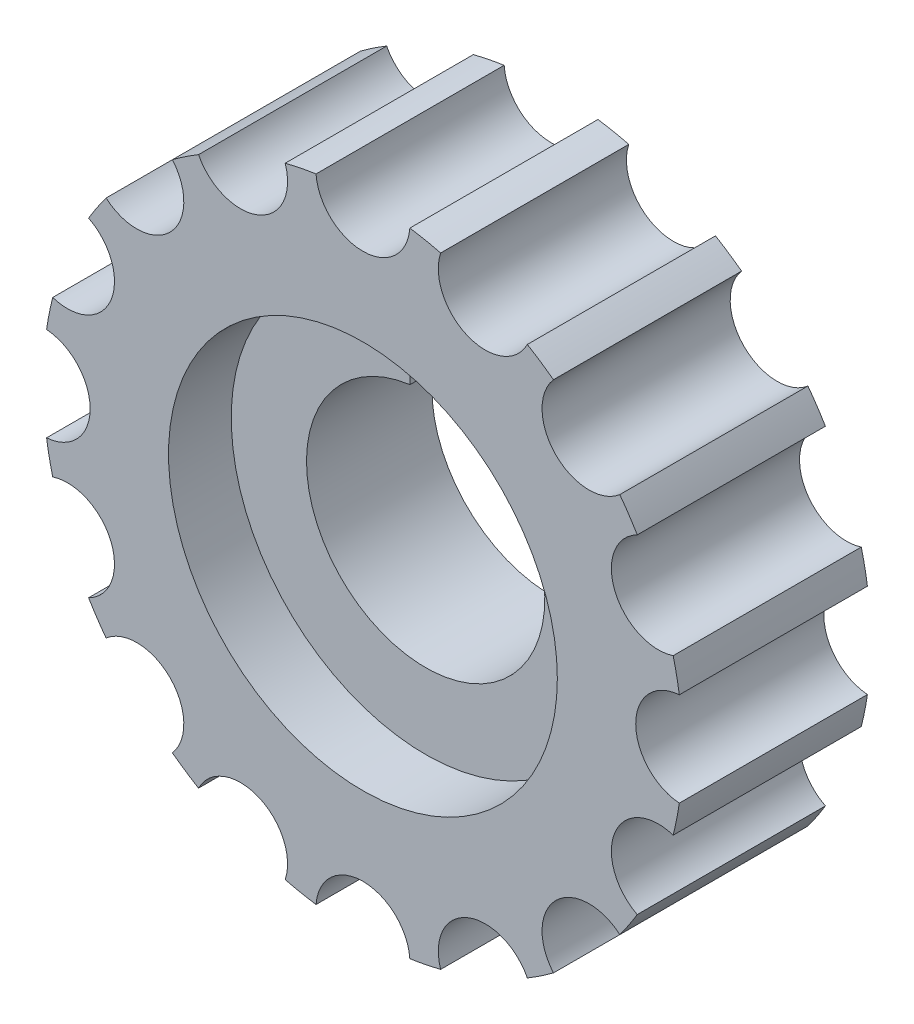
ISO-10303-21;
HEADER;
FILE_DESCRIPTION(('STEP AP214'),'2;1');
FILE_NAME('part.step','',(''),(''),'','','');
FILE_SCHEMA(('AUTOMOTIVE_DESIGN { 1 0 10303 214 1 1 1 1 }'));
ENDSEC;
DATA;
#1=APPLICATION_CONTEXT('core data for automotive mechanical design processes');
#2=APPLICATION_PROTOCOL_DEFINITION('international standard','automotive_design',2000,#1);
#3=PRODUCT_CONTEXT('',#1,'mechanical');
#4=PRODUCT('Part','Part','',(#3));
#5=PRODUCT_RELATED_PRODUCT_CATEGORY('part','',(#4));
#6=PRODUCT_DEFINITION_FORMATION('','',#4);
#7=PRODUCT_DEFINITION_CONTEXT('part definition',#1,'design');
#8=PRODUCT_DEFINITION('design','',#6,#7);
#9=PRODUCT_DEFINITION_SHAPE('','',#8);
#10=(LENGTH_UNIT() NAMED_UNIT(*) SI_UNIT(.MILLI.,.METRE.));
#11=(NAMED_UNIT(*) PLANE_ANGLE_UNIT() SI_UNIT($,.RADIAN.));
#12=(NAMED_UNIT(*) SI_UNIT($,.STERADIAN.) SOLID_ANGLE_UNIT());
#13=UNCERTAINTY_MEASURE_WITH_UNIT(LENGTH_MEASURE(1.E-05),#10,'distance_accuracy_value','');
#14=(GEOMETRIC_REPRESENTATION_CONTEXT(3) GLOBAL_UNCERTAINTY_ASSIGNED_CONTEXT((#13)) GLOBAL_UNIT_ASSIGNED_CONTEXT((#10,
#11,#12)) REPRESENTATION_CONTEXT('',''));
#15=CARTESIAN_POINT('',(0.,0.,0.));
#16=DIRECTION('',(0.,0.,1.));
#17=DIRECTION('',(1.,0.,0.));
#18=AXIS2_PLACEMENT_3D('',#15,#16,#17);
#19=CARTESIAN_POINT('',(0.,0.,0.));
#20=DIRECTION('',(0.,0.,1.));
#21=DIRECTION('',(1.,0.,0.));
#22=AXIS2_PLACEMENT_3D('',#19,#20,#21);
#23=PLANE('',#22);
#24=CARTESIAN_POINT('',(-19.5168550506189,47.1178561580759,0.));
#25=DIRECTION('',(0.,0.,1.));
#26=DIRECTION('',(1.,0.,0.));
#27=AXIS2_PLACEMENT_3D('',#24,#25,#26);
#28=CIRCLE('',#27,7.49999999999999);
#29=CARTESIAN_POINT('',(-26.2161561622921,43.7460073158033,0.));
#30=VERTEX_POINT('',#29);
#31=CARTESIAN_POINT('',(-12.3954766238373,49.4707202218434,0.));
#32=VERTEX_POINT('',#31);
#33=EDGE_CURVE('E307',#30,#32,#28,.T.);
#34=ORIENTED_EDGE('',*,*,#33,.T.);
#35=CARTESIAN_POINT('',(0.,0.,0.));
#36=DIRECTION('',(0.,0.,1.));
#37=DIRECTION('',(1.,0.,0.));
#38=AXIS2_PLACEMENT_3D('',#35,#36,#37);
#39=CIRCLE('',#38,51.);
#40=CARTESIAN_POINT('',(-7.47969786758203,50.4485294117647,0.));
#41=VERTEX_POINT('',#40);
#42=EDGE_CURVE('E317',#41,#32,#39,.T.);
#43=ORIENTED_EDGE('',*,*,#42,.F.);
#44=CARTESIAN_POINT('',(0.,51.,0.));
#45=DIRECTION('',(0.,0.,1.));
#46=DIRECTION('',(1.,0.,0.));
#47=AXIS2_PLACEMENT_3D('',#44,#45,#46);
#48=CIRCLE('',#47,7.49999999999999);
#49=CARTESIAN_POINT('',(7.47969786758203,50.4485294117647,0.));
#50=VERTEX_POINT('',#49);
#51=EDGE_CURVE('E386',#41,#50,#48,.T.);
#52=ORIENTED_EDGE('',*,*,#51,.T.);
#53=CARTESIAN_POINT('',(12.395476623838,49.4707202218432,0.));
#54=VERTEX_POINT('',#53);
#55=EDGE_CURVE('E287',#54,#50,#39,.T.);
#56=ORIENTED_EDGE('',*,*,#55,.F.);
#57=CARTESIAN_POINT('',(19.5168550506196,47.1178561580756,0.));
#58=DIRECTION('',(0.,0.,1.));
#59=DIRECTION('',(1.,0.,0.));
#60=AXIS2_PLACEMENT_3D('',#57,#58,#59);
#61=CIRCLE('',#60,7.49999999999999);
#62=CARTESIAN_POINT('',(26.2161561622927,43.7460073158029,0.));
#63=VERTEX_POINT('',#62);
#64=EDGE_CURVE('E382',#54,#63,#61,.T.);
#65=ORIENTED_EDGE('',*,*,#64,.T.);
#66=CARTESIAN_POINT('',(30.3835521645541,40.9614423313416,0.));
#67=VERTEX_POINT('',#66);
#68=EDGE_CURVE('E381',#67,#63,#39,.T.);
#69=ORIENTED_EDGE('',*,*,#68,.F.);
#70=CARTESIAN_POINT('',(36.062445840514,36.0624458405139,0.));
#71=DIRECTION('',(0.,0.,1.));
#72=DIRECTION('',(1.,0.,0.));
#73=AXIS2_PLACEMENT_3D('',#70,#71,#72);
#74=CIRCLE('',#73,7.49999999999999);
#75=CARTESIAN_POINT('',(40.9614423313417,30.3835521645539,0.));
#76=VERTEX_POINT('',#75);
#77=EDGE_CURVE('E377',#67,#76,#74,.T.);
#78=ORIENTED_EDGE('',*,*,#77,.T.);
#79=CARTESIAN_POINT('',(43.746007315803,26.2161561622925,0.));
#80=VERTEX_POINT('',#79);
#81=EDGE_CURVE('E376',#80,#76,#39,.T.);
#82=ORIENTED_EDGE('',*,*,#81,.F.);
#83=CARTESIAN_POINT('',(47.1178561580757,19.5168550506195,0.));
#84=DIRECTION('',(0.,0.,1.));
#85=DIRECTION('',(1.,0.,0.));
#86=AXIS2_PLACEMENT_3D('',#83,#84,#85);
#87=CIRCLE('',#86,7.49999999999999);
#88=CARTESIAN_POINT('',(49.4707202218433,12.3954766238378,0.));
#89=VERTEX_POINT('',#88);
#90=EDGE_CURVE('E372',#80,#89,#87,.T.);
#91=ORIENTED_EDGE('',*,*,#90,.T.);
#92=CARTESIAN_POINT('',(50.4485294117647,7.47969786758186,0.));
#93=VERTEX_POINT('',#92);
#94=EDGE_CURVE('E371',#93,#89,#39,.T.);
#95=ORIENTED_EDGE('',*,*,#94,.F.);
#96=CARTESIAN_POINT('',(51.,-1.78065548281E-13,0.));
#97=DIRECTION('',(0.,0.,1.));
#98=DIRECTION('',(1.,0.,0.));
#99=AXIS2_PLACEMENT_3D('',#96,#97,#98);
#100=CIRCLE('',#99,7.49999999999999);
#101=CARTESIAN_POINT('',(50.4485294117647,-7.47969786758221,0.));
#102=VERTEX_POINT('',#101);
#103=EDGE_CURVE('E367',#93,#102,#100,.T.);
#104=ORIENTED_EDGE('',*,*,#103,.T.);
#105=CARTESIAN_POINT('',(49.4707202218432,-12.3954766238382,0.));
#106=VERTEX_POINT('',#105);
#107=EDGE_CURVE('E366',#106,#102,#39,.T.);
#108=ORIENTED_EDGE('',*,*,#107,.F.);
#109=CARTESIAN_POINT('',(47.1178561580755,-19.5168550506198,0.));
#110=DIRECTION('',(0.,0.,1.));
#111=DIRECTION('',(1.,0.,0.));
#112=AXIS2_PLACEMENT_3D('',#109,#110,#111);
#113=CIRCLE('',#112,7.49999999999999);
#114=CARTESIAN_POINT('',(43.7460073158028,-26.2161561622929,0.));
#115=VERTEX_POINT('',#114);
#116=EDGE_CURVE('E362',#106,#115,#113,.T.);
#117=ORIENTED_EDGE('',*,*,#116,.T.);
#118=CARTESIAN_POINT('',(40.9614423313415,-30.3835521645542,0.));
#119=VERTEX_POINT('',#118);
#120=EDGE_CURVE('E361',#119,#115,#39,.T.);
#121=ORIENTED_EDGE('',*,*,#120,.F.);
#122=CARTESIAN_POINT('',(36.0624458405137,-36.0624458405141,0.));
#123=DIRECTION('',(0.,0.,1.));
#124=DIRECTION('',(1.,0.,0.));
#125=AXIS2_PLACEMENT_3D('',#122,#123,#124);
#126=CIRCLE('',#125,7.49999999999999);
#127=CARTESIAN_POINT('',(30.3835521645538,-40.9614423313418,0.));
#128=VERTEX_POINT('',#127);
#129=EDGE_CURVE('E357',#119,#128,#126,.T.);
#130=ORIENTED_EDGE('',*,*,#129,.T.);
#131=CARTESIAN_POINT('',(26.2161561622924,-43.7460073158031,0.));
#132=VERTEX_POINT('',#131);
#133=EDGE_CURVE('E356',#132,#128,#39,.T.);
#134=ORIENTED_EDGE('',*,*,#133,.F.);
#135=CARTESIAN_POINT('',(19.5168550506193,-47.1178561580757,0.));
#136=DIRECTION('',(0.,0.,1.));
#137=DIRECTION('',(1.,0.,0.));
#138=AXIS2_PLACEMENT_3D('',#135,#136,#137);
#139=CIRCLE('',#138,7.49999999999998);
#140=CARTESIAN_POINT('',(12.3954766238376,-49.4707202218433,0.));
#141=VERTEX_POINT('',#140);
#142=EDGE_CURVE('E352',#132,#141,#139,.T.);
#143=ORIENTED_EDGE('',*,*,#142,.T.);
#144=CARTESIAN_POINT('',(7.47969786758168,-50.4485294117648,0.));
#145=VERTEX_POINT('',#144);
#146=EDGE_CURVE('E351',#145,#141,#39,.T.);
#147=ORIENTED_EDGE('',*,*,#146,.F.);
#148=CARTESIAN_POINT('',(-3.56131096562E-13,-51.,0.));
#149=DIRECTION('',(0.,0.,1.));
#150=DIRECTION('',(1.,0.,0.));
#151=AXIS2_PLACEMENT_3D('',#148,#149,#150);
#152=CIRCLE('',#151,7.49999999999999);
#153=CARTESIAN_POINT('',(-7.47969786758239,-50.4485294117647,0.));
#154=VERTEX_POINT('',#153);
#155=EDGE_CURVE('E347',#145,#154,#152,.T.);
#156=ORIENTED_EDGE('',*,*,#155,.T.);
#157=CARTESIAN_POINT('',(-12.3954766238383,-49.4707202218431,0.));
#158=VERTEX_POINT('',#157);
#159=EDGE_CURVE('E346',#158,#154,#39,.T.);
#160=ORIENTED_EDGE('',*,*,#159,.F.);
#161=CARTESIAN_POINT('',(-19.5168550506199,-47.1178561580755,0.));
#162=DIRECTION('',(0.,0.,1.));
#163=DIRECTION('',(1.,0.,0.));
#164=AXIS2_PLACEMENT_3D('',#161,#162,#163);
#165=CIRCLE('',#164,7.49999999999999);
#166=CARTESIAN_POINT('',(-26.216156162293,-43.7460073158027,0.));
#167=VERTEX_POINT('',#166);
#168=EDGE_CURVE('E342',#158,#167,#165,.T.);
#169=ORIENTED_EDGE('',*,*,#168,.T.);
#170=CARTESIAN_POINT('',(-30.3835521645544,-40.9614423313414,0.));
#171=VERTEX_POINT('',#170);
#172=EDGE_CURVE('E341',#171,#167,#39,.T.);
#173=ORIENTED_EDGE('',*,*,#172,.F.);
#174=CARTESIAN_POINT('',(-36.0624458405142,-36.0624458405136,0.));
#175=DIRECTION('',(0.,0.,1.));
#176=DIRECTION('',(1.,0.,0.));
#177=AXIS2_PLACEMENT_3D('',#174,#175,#176);
#178=CIRCLE('',#177,7.49999999999998);
#179=CARTESIAN_POINT('',(-40.9614423313419,-30.3835521645536,0.));
#180=VERTEX_POINT('',#179);
#181=EDGE_CURVE('E337',#171,#180,#178,.T.);
#182=ORIENTED_EDGE('',*,*,#181,.T.);
#183=CARTESIAN_POINT('',(-43.7460073158032,-26.2161561622922,0.));
#184=VERTEX_POINT('',#183);
#185=EDGE_CURVE('E336',#184,#180,#39,.T.);
#186=ORIENTED_EDGE('',*,*,#185,.F.);
#187=CARTESIAN_POINT('',(-47.1178561580758,-19.5168550506191,0.));
#188=DIRECTION('',(0.,0.,1.));
#189=DIRECTION('',(1.,0.,0.));
#190=AXIS2_PLACEMENT_3D('',#187,#188,#189);
#191=CIRCLE('',#190,7.49999999999999);
#192=CARTESIAN_POINT('',(-49.4707202218433,-12.3954766238374,0.));
#193=VERTEX_POINT('',#192);
#194=EDGE_CURVE('E332',#184,#193,#191,.T.);
#195=ORIENTED_EDGE('',*,*,#194,.T.);
#196=CARTESIAN_POINT('',(-50.4485294117648,-7.47969786758151,0.));
#197=VERTEX_POINT('',#196);
#198=EDGE_CURVE('E331',#197,#193,#39,.T.);
#199=ORIENTED_EDGE('',*,*,#198,.F.);
#200=CARTESIAN_POINT('',(-51.,5.34196644842999E-13,0.));
#201=DIRECTION('',(0.,0.,1.));
#202=DIRECTION('',(1.,0.,0.));
#203=AXIS2_PLACEMENT_3D('',#200,#201,#202);
#204=CIRCLE('',#203,7.49999999999999);
#205=CARTESIAN_POINT('',(-50.4485294117646,7.47969786758256,0.));
#206=VERTEX_POINT('',#205);
#207=EDGE_CURVE('E327',#197,#206,#204,.T.);
#208=ORIENTED_EDGE('',*,*,#207,.T.);
#209=CARTESIAN_POINT('',(-49.4707202218431,12.3954766238385,0.));
#210=VERTEX_POINT('',#209);
#211=EDGE_CURVE('E326',#210,#206,#39,.T.);
#212=ORIENTED_EDGE('',*,*,#211,.F.);
#213=CARTESIAN_POINT('',(-47.1178561580754,19.5168550506201,0.));
#214=DIRECTION('',(0.,0.,1.));
#215=DIRECTION('',(1.,0.,0.));
#216=AXIS2_PLACEMENT_3D('',#213,#214,#215);
#217=CIRCLE('',#216,7.49999999999999);
#218=CARTESIAN_POINT('',(-43.7460073158027,26.2161561622931,0.));
#219=VERTEX_POINT('',#218);
#220=EDGE_CURVE('E322',#210,#219,#217,.T.);
#221=ORIENTED_EDGE('',*,*,#220,.T.);
#222=CARTESIAN_POINT('',(-40.9614423313413,30.3835521645545,0.));
#223=VERTEX_POINT('',#222);
#224=EDGE_CURVE('E318',#223,#219,#39,.T.);
#225=ORIENTED_EDGE('',*,*,#224,.F.);
#226=CARTESIAN_POINT('',(-36.0624458405135,36.0624458405144,0.));
#227=DIRECTION('',(0.,0.,1.));
#228=DIRECTION('',(1.,0.,0.));
#229=AXIS2_PLACEMENT_3D('',#226,#227,#228);
#230=CIRCLE('',#229,7.49999999999999);
#231=CARTESIAN_POINT('',(-30.3835521645535,40.961442331342,0.));
#232=VERTEX_POINT('',#231);
#233=EDGE_CURVE('E316',#223,#232,#230,.T.);
#234=ORIENTED_EDGE('',*,*,#233,.T.);
#235=EDGE_CURVE('E311',#30,#232,#39,.T.);
#236=ORIENTED_EDGE('',*,*,#235,.F.);
#237=EDGE_LOOP('',(#34,#43,#52,#56,#65,#69,#78,#82,#91,#95,#104,#108,#117,#121,#130,#134,#143,
#147,#156,#160,#169,#173,#182,#186,#195,#199,#208,#212,#221,#225,#234,#236));
#238=FACE_BOUND('',#237,.T.);
#239=DIRECTION('',(0.,1.,0.));
#240=VECTOR('',#239,1.);
#241=CARTESIAN_POINT('',(2.5,24.7671208505366,0.));
#242=LINE('',#241,#240);
#243=CARTESIAN_POINT('',(2.5,18.8348082018374,0.));
#244=VERTEX_POINT('',#243);
#245=CARTESIAN_POINT('',(2.5,24.7671208505366,0.));
#246=VERTEX_POINT('',#245);
#247=EDGE_CURVE('E1071',#244,#246,#242,.T.);
#248=ORIENTED_EDGE('',*,*,#247,.T.);
#249=DIRECTION('',(-1.,0.,0.));
#250=VECTOR('',#249,1.);
#251=CARTESIAN_POINT('',(-2.5,24.7671208505366,0.));
#252=LINE('',#251,#250);
#253=CARTESIAN_POINT('',(-2.5,24.7671208505366,0.));
#254=VERTEX_POINT('',#253);
#255=EDGE_CURVE('E1066',#246,#254,#252,.T.);
#256=ORIENTED_EDGE('',*,*,#255,.T.);
#257=DIRECTION('',(0.,-1.,0.));
#258=VECTOR('',#257,1.);
#259=CARTESIAN_POINT('',(-2.5,24.7671208505366,0.));
#260=LINE('',#259,#258);
#261=CARTESIAN_POINT('',(-2.5,18.8348082018374,0.));
#262=VERTEX_POINT('',#261);
#263=EDGE_CURVE('E1054',#254,#262,#260,.T.);
#264=ORIENTED_EDGE('',*,*,#263,.T.);
#265=CARTESIAN_POINT('',(0.,0.,0.));
#266=DIRECTION('',(0.,0.,1.));
#267=DIRECTION('',(1.,0.,0.));
#268=AXIS2_PLACEMENT_3D('',#265,#266,#267);
#269=CIRCLE('',#268,19.);
#270=EDGE_CURVE('E669',#262,#244,#269,.T.);
#271=ORIENTED_EDGE('',*,*,#270,.T.);
#272=EDGE_LOOP('',(#248,#256,#264,#271));
#273=FACE_BOUND('',#272,.T.);
#274=ADVANCED_FACE('F45',(#238,#273),#23,.F.);
#275=CARTESIAN_POINT('',(0.,0.,20.));
#276=DIRECTION('',(0.,0.,-1.));
#277=DIRECTION('',(-1.,0.,0.));
#278=AXIS2_PLACEMENT_3D('',#275,#276,#277);
#279=CYLINDRICAL_SURFACE('',#278,19.);
#280=CARTESIAN_POINT('',(0.,0.,20.));
#281=DIRECTION('',(0.,0.,1.));
#282=DIRECTION('',(1.,0.,0.));
#283=AXIS2_PLACEMENT_3D('',#280,#281,#282);
#284=CIRCLE('',#283,19.);
#285=CARTESIAN_POINT('',(-2.5,18.8348082018374,20.));
#286=VERTEX_POINT('',#285);
#287=CARTESIAN_POINT('',(2.5,18.8348082018374,20.));
#288=VERTEX_POINT('',#287);
#289=EDGE_CURVE('E312',#286,#288,#284,.T.);
#290=ORIENTED_EDGE('',*,*,#289,.T.);
#291=DIRECTION('',(0.,0.,-1.));
#292=VECTOR('',#291,1.);
#293=CARTESIAN_POINT('',(2.5,18.8348082018374,20.));
#294=LINE('',#293,#292);
#295=EDGE_CURVE('E1088',#288,#244,#294,.T.);
#296=ORIENTED_EDGE('',*,*,#295,.T.);
#297=ORIENTED_EDGE('',*,*,#270,.F.);
#298=DIRECTION('',(0.,0.,-1.));
#299=VECTOR('',#298,1.);
#300=CARTESIAN_POINT('',(-2.5,18.8348082018374,20.));
#301=LINE('',#300,#299);
#302=EDGE_CURVE('E1058',#262,#286,#301,.F.);
#303=ORIENTED_EDGE('',*,*,#302,.T.);
#304=EDGE_LOOP('',(#290,#296,#297,#303));
#305=FACE_BOUND('',#304,.T.);
#306=ADVANCED_FACE('F502',(#305),#279,.F.);
#307=CARTESIAN_POINT('',(0.,0.,20.));
#308=DIRECTION('',(0.,0.,1.));
#309=DIRECTION('',(1.,0.,0.));
#310=AXIS2_PLACEMENT_3D('',#307,#308,#309);
#311=PLANE('',#310);
#312=CARTESIAN_POINT('',(0.,0.,20.));
#313=DIRECTION('',(0.,0.,1.));
#314=DIRECTION('',(1.,0.,0.));
#315=AXIS2_PLACEMENT_3D('',#312,#313,#314);
#316=CIRCLE('',#315,31.);
#317=CARTESIAN_POINT('',(31.,0.,20.));
#318=VERTEX_POINT('',#317);
#319=EDGE_CURVE('E54',#318,#318,#316,.T.);
#320=ORIENTED_EDGE('',*,*,#319,.T.);
#321=EDGE_LOOP('',(#320));
#322=FACE_BOUND('',#321,.T.);
#323=DIRECTION('',(-1.,0.,0.));
#324=VECTOR('',#323,1.);
#325=CARTESIAN_POINT('',(-2.5,24.7671208505366,20.));
#326=LINE('',#325,#324);
#327=CARTESIAN_POINT('',(2.5,24.7671208505366,20.));
#328=VERTEX_POINT('',#327);
#329=CARTESIAN_POINT('',(-2.5,24.7671208505366,20.));
#330=VERTEX_POINT('',#329);
#331=EDGE_CURVE('E1065',#328,#330,#326,.T.);
#332=ORIENTED_EDGE('',*,*,#331,.F.);
#333=DIRECTION('',(0.,-1.,0.));
#334=VECTOR('',#333,1.);
#335=CARTESIAN_POINT('',(2.5,0.,20.));
#336=LINE('',#335,#334);
#337=EDGE_CURVE('E11',#328,#288,#336,.T.);
#338=ORIENTED_EDGE('',*,*,#337,.T.);
#339=ORIENTED_EDGE('',*,*,#289,.F.);
#340=DIRECTION('',(0.,-1.,0.));
#341=VECTOR('',#340,1.);
#342=CARTESIAN_POINT('',(-2.5,24.7671208505366,20.));
#343=LINE('',#342,#341);
#344=EDGE_CURVE('E1083',#330,#286,#343,.T.);
#345=ORIENTED_EDGE('',*,*,#344,.F.);
#346=EDGE_LOOP('',(#332,#338,#339,#345));
#347=FACE_BOUND('',#346,.T.);
#348=ADVANCED_FACE('F481',(#322,#347),#311,.T.);
#349=CARTESIAN_POINT('',(-19.5168550506189,47.1178561580759,30.));
#350=DIRECTION('',(0.,0.,-1.));
#351=DIRECTION('',(-1.,0.,0.));
#352=AXIS2_PLACEMENT_3D('',#349,#350,#351);
#353=CYLINDRICAL_SURFACE('',#352,7.49999999999999);
#354=ORIENTED_EDGE('',*,*,#33,.F.);
#355=DIRECTION('',(0.,0.,-1.));
#356=VECTOR('',#355,1.);
#357=CARTESIAN_POINT('',(-26.2161561622921,43.7460073158033,30.));
#358=LINE('',#357,#356);
#359=CARTESIAN_POINT('',(-26.2161561622921,43.7460073158033,30.));
#360=VERTEX_POINT('',#359);
#361=EDGE_CURVE('E181',#360,#30,#358,.T.);
#362=ORIENTED_EDGE('',*,*,#361,.F.);
#363=CARTESIAN_POINT('',(-19.5168550506189,47.1178561580759,30.));
#364=DIRECTION('',(0.,0.,1.));
#365=DIRECTION('',(1.,0.,0.));
#366=AXIS2_PLACEMENT_3D('',#363,#364,#365);
#367=CIRCLE('',#366,7.49999999999999);
#368=CARTESIAN_POINT('',(-12.3954766238373,49.4707202218434,30.));
#369=VERTEX_POINT('',#368);
#370=EDGE_CURVE('E661',#360,#369,#367,.T.);
#371=ORIENTED_EDGE('',*,*,#370,.T.);
#372=DIRECTION('',(0.,0.,-1.));
#373=VECTOR('',#372,1.);
#374=CARTESIAN_POINT('',(-12.3954766238373,49.4707202218434,30.));
#375=LINE('',#374,#373);
#376=EDGE_CURVE('E176',#369,#32,#375,.T.);
#377=ORIENTED_EDGE('',*,*,#376,.T.);
#378=EDGE_LOOP('',(#354,#362,#371,#377));
#379=FACE_BOUND('',#378,.T.);
#380=ADVANCED_FACE('F47',(#379),#353,.F.);
#381=CARTESIAN_POINT('',(0.,0.,30.));
#382=DIRECTION('',(0.,0.,-1.));
#383=DIRECTION('',(-1.,0.,0.));
#384=AXIS2_PLACEMENT_3D('',#381,#382,#383);
#385=CYLINDRICAL_SURFACE('',#384,51.);
#386=ORIENTED_EDGE('',*,*,#235,.T.);
#387=DIRECTION('',(0.,0.,-1.));
#388=VECTOR('',#387,1.);
#389=CARTESIAN_POINT('',(-30.3835521645535,40.961442331342,30.));
#390=LINE('',#389,#388);
#391=CARTESIAN_POINT('',(-30.3835521645535,40.961442331342,30.));
#392=VERTEX_POINT('',#391);
#393=EDGE_CURVE('E473',#392,#232,#390,.T.);
#394=ORIENTED_EDGE('',*,*,#393,.F.);
#395=CARTESIAN_POINT('',(0.,0.,30.));
#396=DIRECTION('',(0.,0.,1.));
#397=DIRECTION('',(1.,0.,0.));
#398=AXIS2_PLACEMENT_3D('',#395,#396,#397);
#399=CIRCLE('',#398,51.);
#400=EDGE_CURVE('E300',#360,#392,#399,.T.);
#401=ORIENTED_EDGE('',*,*,#400,.F.);
#402=ORIENTED_EDGE('',*,*,#361,.T.);
#403=EDGE_LOOP('',(#386,#394,#401,#402));
#404=FACE_BOUND('',#403,.T.);
#405=ADVANCED_FACE('F513',(#404),#385,.T.);
#406=CARTESIAN_POINT('',(-36.0624458405135,36.0624458405144,30.));
#407=DIRECTION('',(0.,0.,-1.));
#408=DIRECTION('',(-1.,0.,0.));
#409=AXIS2_PLACEMENT_3D('',#406,#407,#408);
#410=CYLINDRICAL_SURFACE('',#409,7.49999999999999);
#411=ORIENTED_EDGE('',*,*,#233,.F.);
#412=DIRECTION('',(0.,0.,-1.));
#413=VECTOR('',#412,1.);
#414=CARTESIAN_POINT('',(-40.9614423313413,30.3835521645545,30.));
#415=LINE('',#414,#413);
#416=CARTESIAN_POINT('',(-40.9614423313413,30.3835521645545,30.));
#417=VERTEX_POINT('',#416);
#418=EDGE_CURVE('E470',#417,#223,#415,.T.);
#419=ORIENTED_EDGE('',*,*,#418,.F.);
#420=CARTESIAN_POINT('',(-36.0624458405135,36.0624458405144,30.));
#421=DIRECTION('',(0.,0.,1.));
#422=DIRECTION('',(1.,0.,0.));
#423=AXIS2_PLACEMENT_3D('',#420,#421,#422);
#424=CIRCLE('',#423,7.49999999999999);
#425=EDGE_CURVE('E666',#417,#392,#424,.T.);
#426=ORIENTED_EDGE('',*,*,#425,.T.);
#427=ORIENTED_EDGE('',*,*,#393,.T.);
#428=EDGE_LOOP('',(#411,#419,#426,#427));
#429=FACE_BOUND('',#428,.T.);
#430=ADVANCED_FACE('F580',(#429),#410,.F.);
#431=ORIENTED_EDGE('',*,*,#224,.T.);
#432=DIRECTION('',(0.,0.,-1.));
#433=VECTOR('',#432,1.);
#434=CARTESIAN_POINT('',(-43.7460073158027,26.2161561622931,30.));
#435=LINE('',#434,#433);
#436=CARTESIAN_POINT('',(-43.7460073158027,26.2161561622931,30.));
#437=VERTEX_POINT('',#436);
#438=EDGE_CURVE('E467',#437,#219,#435,.T.);
#439=ORIENTED_EDGE('',*,*,#438,.F.);
#440=EDGE_CURVE('E667',#417,#437,#399,.T.);
#441=ORIENTED_EDGE('',*,*,#440,.F.);
#442=ORIENTED_EDGE('',*,*,#418,.T.);
#443=EDGE_LOOP('',(#431,#439,#441,#442));
#444=FACE_BOUND('',#443,.T.);
#445=ADVANCED_FACE('F578',(#444),#385,.T.);
#446=CARTESIAN_POINT('',(-47.1178561580754,19.5168550506201,30.));
#447=DIRECTION('',(0.,0.,-1.));
#448=DIRECTION('',(-1.,0.,0.));
#449=AXIS2_PLACEMENT_3D('',#446,#447,#448);
#450=CYLINDRICAL_SURFACE('',#449,7.49999999999999);
#451=ORIENTED_EDGE('',*,*,#220,.F.);
#452=DIRECTION('',(0.,0.,-1.));
#453=VECTOR('',#452,1.);
#454=CARTESIAN_POINT('',(-49.4707202218431,12.3954766238385,30.));
#455=LINE('',#454,#453);
#456=CARTESIAN_POINT('',(-49.4707202218431,12.3954766238385,30.));
#457=VERTEX_POINT('',#456);
#458=EDGE_CURVE('E464',#457,#210,#455,.T.);
#459=ORIENTED_EDGE('',*,*,#458,.F.);
#460=CARTESIAN_POINT('',(-47.1178561580754,19.5168550506201,30.));
#461=DIRECTION('',(0.,0.,1.));
#462=DIRECTION('',(1.,0.,0.));
#463=AXIS2_PLACEMENT_3D('',#460,#461,#462);
#464=CIRCLE('',#463,7.49999999999999);
#465=EDGE_CURVE('E674',#457,#437,#464,.T.);
#466=ORIENTED_EDGE('',*,*,#465,.T.);
#467=ORIENTED_EDGE('',*,*,#438,.T.);
#468=EDGE_LOOP('',(#451,#459,#466,#467));
#469=FACE_BOUND('',#468,.T.);
#470=ADVANCED_FACE('F576',(#469),#450,.F.);
#471=ORIENTED_EDGE('',*,*,#211,.T.);
#472=DIRECTION('',(0.,0.,-1.));
#473=VECTOR('',#472,1.);
#474=CARTESIAN_POINT('',(-50.4485294117646,7.47969786758256,30.));
#475=LINE('',#474,#473);
#476=CARTESIAN_POINT('',(-50.4485294117646,7.47969786758256,30.));
#477=VERTEX_POINT('',#476);
#478=EDGE_CURVE('E461',#477,#206,#475,.T.);
#479=ORIENTED_EDGE('',*,*,#478,.F.);
#480=EDGE_CURVE('E678',#457,#477,#399,.T.);
#481=ORIENTED_EDGE('',*,*,#480,.F.);
#482=ORIENTED_EDGE('',*,*,#458,.T.);
#483=EDGE_LOOP('',(#471,#479,#481,#482));
#484=FACE_BOUND('',#483,.T.);
#485=ADVANCED_FACE('F574',(#484),#385,.T.);
#486=CARTESIAN_POINT('',(-51.,5.34196644842999E-13,30.));
#487=DIRECTION('',(0.,0.,-1.));
#488=DIRECTION('',(-1.,0.,0.));
#489=AXIS2_PLACEMENT_3D('',#486,#487,#488);
#490=CYLINDRICAL_SURFACE('',#489,7.49999999999999);
#491=ORIENTED_EDGE('',*,*,#207,.F.);
#492=DIRECTION('',(0.,0.,-1.));
#493=VECTOR('',#492,1.);
#494=CARTESIAN_POINT('',(-50.4485294117648,-7.47969786758151,30.));
#495=LINE('',#494,#493);
#496=CARTESIAN_POINT('',(-50.4485294117648,-7.47969786758151,30.));
#497=VERTEX_POINT('',#496);
#498=EDGE_CURVE('E458',#497,#197,#495,.T.);
#499=ORIENTED_EDGE('',*,*,#498,.F.);
#500=CARTESIAN_POINT('',(-51.,5.34196644842999E-13,30.));
#501=DIRECTION('',(0.,0.,1.));
#502=DIRECTION('',(1.,0.,0.));
#503=AXIS2_PLACEMENT_3D('',#500,#501,#502);
#504=CIRCLE('',#503,7.49999999999999);
#505=EDGE_CURVE('E679',#497,#477,#504,.T.);
#506=ORIENTED_EDGE('',*,*,#505,.T.);
#507=ORIENTED_EDGE('',*,*,#478,.T.);
#508=EDGE_LOOP('',(#491,#499,#506,#507));
#509=FACE_BOUND('',#508,.T.);
#510=ADVANCED_FACE('F571',(#509),#490,.F.);
#511=ORIENTED_EDGE('',*,*,#198,.T.);
#512=DIRECTION('',(0.,0.,-1.));
#513=VECTOR('',#512,1.);
#514=CARTESIAN_POINT('',(-49.4707202218433,-12.3954766238374,30.));
#515=LINE('',#514,#513);
#516=CARTESIAN_POINT('',(-49.4707202218433,-12.3954766238374,30.));
#517=VERTEX_POINT('',#516);
#518=EDGE_CURVE('E455',#517,#193,#515,.T.);
#519=ORIENTED_EDGE('',*,*,#518,.F.);
#520=EDGE_CURVE('E683',#497,#517,#399,.T.);
#521=ORIENTED_EDGE('',*,*,#520,.F.);
#522=ORIENTED_EDGE('',*,*,#498,.T.);
#523=EDGE_LOOP('',(#511,#519,#521,#522));
#524=FACE_BOUND('',#523,.T.);
#525=ADVANCED_FACE('F569',(#524),#385,.T.);
#526=CARTESIAN_POINT('',(-47.1178561580758,-19.5168550506191,30.));
#527=DIRECTION('',(0.,0.,-1.));
#528=DIRECTION('',(-1.,0.,0.));
#529=AXIS2_PLACEMENT_3D('',#526,#527,#528);
#530=CYLINDRICAL_SURFACE('',#529,7.49999999999999);
#531=ORIENTED_EDGE('',*,*,#194,.F.);
#532=DIRECTION('',(0.,0.,-1.));
#533=VECTOR('',#532,1.);
#534=CARTESIAN_POINT('',(-43.7460073158032,-26.2161561622922,30.));
#535=LINE('',#534,#533);
#536=CARTESIAN_POINT('',(-43.7460073158032,-26.2161561622922,30.));
#537=VERTEX_POINT('',#536);
#538=EDGE_CURVE('E452',#537,#184,#535,.T.);
#539=ORIENTED_EDGE('',*,*,#538,.F.);
#540=CARTESIAN_POINT('',(-47.1178561580758,-19.5168550506191,30.));
#541=DIRECTION('',(0.,0.,1.));
#542=DIRECTION('',(1.,0.,0.));
#543=AXIS2_PLACEMENT_3D('',#540,#541,#542);
#544=CIRCLE('',#543,7.49999999999999);
#545=EDGE_CURVE('E684',#537,#517,#544,.T.);
#546=ORIENTED_EDGE('',*,*,#545,.T.);
#547=ORIENTED_EDGE('',*,*,#518,.T.);
#548=EDGE_LOOP('',(#531,#539,#546,#547));
#549=FACE_BOUND('',#548,.T.);
#550=ADVANCED_FACE('F566',(#549),#530,.F.);
#551=ORIENTED_EDGE('',*,*,#185,.T.);
#552=DIRECTION('',(0.,0.,-1.));
#553=VECTOR('',#552,1.);
#554=CARTESIAN_POINT('',(-40.9614423313419,-30.3835521645536,30.));
#555=LINE('',#554,#553);
#556=CARTESIAN_POINT('',(-40.9614423313419,-30.3835521645536,30.));
#557=VERTEX_POINT('',#556);
#558=EDGE_CURVE('E449',#557,#180,#555,.T.);
#559=ORIENTED_EDGE('',*,*,#558,.F.);
#560=EDGE_CURVE('E688',#537,#557,#399,.T.);
#561=ORIENTED_EDGE('',*,*,#560,.F.);
#562=ORIENTED_EDGE('',*,*,#538,.T.);
#563=EDGE_LOOP('',(#551,#559,#561,#562));
#564=FACE_BOUND('',#563,.T.);
#565=ADVANCED_FACE('F564',(#564),#385,.T.);
#566=CARTESIAN_POINT('',(-36.0624458405142,-36.0624458405136,30.));
#567=DIRECTION('',(0.,0.,-1.));
#568=DIRECTION('',(-1.,0.,0.));
#569=AXIS2_PLACEMENT_3D('',#566,#567,#568);
#570=CYLINDRICAL_SURFACE('',#569,7.49999999999998);
#571=ORIENTED_EDGE('',*,*,#181,.F.);
#572=DIRECTION('',(0.,0.,-1.));
#573=VECTOR('',#572,1.);
#574=CARTESIAN_POINT('',(-30.3835521645544,-40.9614423313414,30.));
#575=LINE('',#574,#573);
#576=CARTESIAN_POINT('',(-30.3835521645544,-40.9614423313414,30.));
#577=VERTEX_POINT('',#576);
#578=EDGE_CURVE('E446',#577,#171,#575,.T.);
#579=ORIENTED_EDGE('',*,*,#578,.F.);
#580=CARTESIAN_POINT('',(-36.0624458405142,-36.0624458405136,30.));
#581=DIRECTION('',(0.,0.,1.));
#582=DIRECTION('',(1.,0.,0.));
#583=AXIS2_PLACEMENT_3D('',#580,#581,#582);
#584=CIRCLE('',#583,7.49999999999998);
#585=EDGE_CURVE('E689',#577,#557,#584,.T.);
#586=ORIENTED_EDGE('',*,*,#585,.T.);
#587=ORIENTED_EDGE('',*,*,#558,.T.);
#588=EDGE_LOOP('',(#571,#579,#586,#587));
#589=FACE_BOUND('',#588,.T.);
#590=ADVANCED_FACE('F561',(#589),#570,.F.);
#591=ORIENTED_EDGE('',*,*,#172,.T.);
#592=DIRECTION('',(0.,0.,-1.));
#593=VECTOR('',#592,1.);
#594=CARTESIAN_POINT('',(-26.216156162293,-43.7460073158027,30.));
#595=LINE('',#594,#593);
#596=CARTESIAN_POINT('',(-26.216156162293,-43.7460073158027,30.));
#597=VERTEX_POINT('',#596);
#598=EDGE_CURVE('E443',#597,#167,#595,.T.);
#599=ORIENTED_EDGE('',*,*,#598,.F.);
#600=EDGE_CURVE('E693',#577,#597,#399,.T.);
#601=ORIENTED_EDGE('',*,*,#600,.F.);
#602=ORIENTED_EDGE('',*,*,#578,.T.);
#603=EDGE_LOOP('',(#591,#599,#601,#602));
#604=FACE_BOUND('',#603,.T.);
#605=ADVANCED_FACE('F559',(#604),#385,.T.);
#606=CARTESIAN_POINT('',(-19.5168550506199,-47.1178561580755,30.));
#607=DIRECTION('',(0.,0.,-1.));
#608=DIRECTION('',(-1.,0.,0.));
#609=AXIS2_PLACEMENT_3D('',#606,#607,#608);
#610=CYLINDRICAL_SURFACE('',#609,7.49999999999999);
#611=ORIENTED_EDGE('',*,*,#168,.F.);
#612=DIRECTION('',(0.,0.,-1.));
#613=VECTOR('',#612,1.);
#614=CARTESIAN_POINT('',(-12.3954766238383,-49.4707202218431,30.));
#615=LINE('',#614,#613);
#616=CARTESIAN_POINT('',(-12.3954766238383,-49.4707202218431,30.));
#617=VERTEX_POINT('',#616);
#618=EDGE_CURVE('E440',#617,#158,#615,.T.);
#619=ORIENTED_EDGE('',*,*,#618,.F.);
#620=CARTESIAN_POINT('',(-19.5168550506199,-47.1178561580755,30.));
#621=DIRECTION('',(0.,0.,1.));
#622=DIRECTION('',(1.,0.,0.));
#623=AXIS2_PLACEMENT_3D('',#620,#621,#622);
#624=CIRCLE('',#623,7.49999999999999);
#625=EDGE_CURVE('E694',#617,#597,#624,.T.);
#626=ORIENTED_EDGE('',*,*,#625,.T.);
#627=ORIENTED_EDGE('',*,*,#598,.T.);
#628=EDGE_LOOP('',(#611,#619,#626,#627));
#629=FACE_BOUND('',#628,.T.);
#630=ADVANCED_FACE('F556',(#629),#610,.F.);
#631=ORIENTED_EDGE('',*,*,#159,.T.);
#632=DIRECTION('',(0.,0.,-1.));
#633=VECTOR('',#632,1.);
#634=CARTESIAN_POINT('',(-7.47969786758239,-50.4485294117647,30.));
#635=LINE('',#634,#633);
#636=CARTESIAN_POINT('',(-7.47969786758239,-50.4485294117647,30.));
#637=VERTEX_POINT('',#636);
#638=EDGE_CURVE('E437',#637,#154,#635,.T.);
#639=ORIENTED_EDGE('',*,*,#638,.F.);
#640=EDGE_CURVE('E698',#617,#637,#399,.T.);
#641=ORIENTED_EDGE('',*,*,#640,.F.);
#642=ORIENTED_EDGE('',*,*,#618,.T.);
#643=EDGE_LOOP('',(#631,#639,#641,#642));
#644=FACE_BOUND('',#643,.T.);
#645=ADVANCED_FACE('F554',(#644),#385,.T.);
#646=CARTESIAN_POINT('',(-3.56131096562E-13,-51.,30.));
#647=DIRECTION('',(0.,0.,-1.));
#648=DIRECTION('',(-1.,0.,0.));
#649=AXIS2_PLACEMENT_3D('',#646,#647,#648);
#650=CYLINDRICAL_SURFACE('',#649,7.49999999999999);
#651=ORIENTED_EDGE('',*,*,#155,.F.);
#652=DIRECTION('',(0.,0.,-1.));
#653=VECTOR('',#652,1.);
#654=CARTESIAN_POINT('',(7.47969786758168,-50.4485294117648,30.));
#655=LINE('',#654,#653);
#656=CARTESIAN_POINT('',(7.47969786758168,-50.4485294117648,30.));
#657=VERTEX_POINT('',#656);
#658=EDGE_CURVE('E434',#657,#145,#655,.T.);
#659=ORIENTED_EDGE('',*,*,#658,.F.);
#660=CARTESIAN_POINT('',(-3.56131096562E-13,-51.,30.));
#661=DIRECTION('',(0.,0.,1.));
#662=DIRECTION('',(1.,0.,0.));
#663=AXIS2_PLACEMENT_3D('',#660,#661,#662);
#664=CIRCLE('',#663,7.49999999999999);
#665=EDGE_CURVE('E699',#657,#637,#664,.T.);
#666=ORIENTED_EDGE('',*,*,#665,.T.);
#667=ORIENTED_EDGE('',*,*,#638,.T.);
#668=EDGE_LOOP('',(#651,#659,#666,#667));
#669=FACE_BOUND('',#668,.T.);
#670=ADVANCED_FACE('F551',(#669),#650,.F.);
#671=ORIENTED_EDGE('',*,*,#146,.T.);
#672=DIRECTION('',(0.,0.,-1.));
#673=VECTOR('',#672,1.);
#674=CARTESIAN_POINT('',(12.3954766238376,-49.4707202218433,30.));
#675=LINE('',#674,#673);
#676=CARTESIAN_POINT('',(12.3954766238376,-49.4707202218433,30.));
#677=VERTEX_POINT('',#676);
#678=EDGE_CURVE('E431',#677,#141,#675,.T.);
#679=ORIENTED_EDGE('',*,*,#678,.F.);
#680=EDGE_CURVE('E703',#657,#677,#399,.T.);
#681=ORIENTED_EDGE('',*,*,#680,.F.);
#682=ORIENTED_EDGE('',*,*,#658,.T.);
#683=EDGE_LOOP('',(#671,#679,#681,#682));
#684=FACE_BOUND('',#683,.T.);
#685=ADVANCED_FACE('F549',(#684),#385,.T.);
#686=CARTESIAN_POINT('',(19.5168550506193,-47.1178561580757,30.));
#687=DIRECTION('',(0.,0.,-1.));
#688=DIRECTION('',(-1.,0.,0.));
#689=AXIS2_PLACEMENT_3D('',#686,#687,#688);
#690=CYLINDRICAL_SURFACE('',#689,7.49999999999998);
#691=ORIENTED_EDGE('',*,*,#142,.F.);
#692=DIRECTION('',(0.,0.,-1.));
#693=VECTOR('',#692,1.);
#694=CARTESIAN_POINT('',(26.2161561622924,-43.7460073158031,30.));
#695=LINE('',#694,#693);
#696=CARTESIAN_POINT('',(26.2161561622924,-43.7460073158031,30.));
#697=VERTEX_POINT('',#696);
#698=EDGE_CURVE('E428',#697,#132,#695,.T.);
#699=ORIENTED_EDGE('',*,*,#698,.F.);
#700=CARTESIAN_POINT('',(19.5168550506193,-47.1178561580757,30.));
#701=DIRECTION('',(0.,0.,1.));
#702=DIRECTION('',(1.,0.,0.));
#703=AXIS2_PLACEMENT_3D('',#700,#701,#702);
#704=CIRCLE('',#703,7.49999999999998);
#705=EDGE_CURVE('E704',#697,#677,#704,.T.);
#706=ORIENTED_EDGE('',*,*,#705,.T.);
#707=ORIENTED_EDGE('',*,*,#678,.T.);
#708=EDGE_LOOP('',(#691,#699,#706,#707));
#709=FACE_BOUND('',#708,.T.);
#710=ADVANCED_FACE('F546',(#709),#690,.F.);
#711=ORIENTED_EDGE('',*,*,#133,.T.);
#712=DIRECTION('',(0.,0.,-1.));
#713=VECTOR('',#712,1.);
#714=CARTESIAN_POINT('',(30.3835521645538,-40.9614423313418,30.));
#715=LINE('',#714,#713);
#716=CARTESIAN_POINT('',(30.3835521645538,-40.9614423313418,30.));
#717=VERTEX_POINT('',#716);
#718=EDGE_CURVE('E425',#717,#128,#715,.T.);
#719=ORIENTED_EDGE('',*,*,#718,.F.);
#720=EDGE_CURVE('E708',#697,#717,#399,.T.);
#721=ORIENTED_EDGE('',*,*,#720,.F.);
#722=ORIENTED_EDGE('',*,*,#698,.T.);
#723=EDGE_LOOP('',(#711,#719,#721,#722));
#724=FACE_BOUND('',#723,.T.);
#725=ADVANCED_FACE('F544',(#724),#385,.T.);
#726=CARTESIAN_POINT('',(36.0624458405137,-36.0624458405141,30.));
#727=DIRECTION('',(0.,0.,-1.));
#728=DIRECTION('',(-1.,0.,0.));
#729=AXIS2_PLACEMENT_3D('',#726,#727,#728);
#730=CYLINDRICAL_SURFACE('',#729,7.49999999999999);
#731=ORIENTED_EDGE('',*,*,#129,.F.);
#732=DIRECTION('',(0.,0.,-1.));
#733=VECTOR('',#732,1.);
#734=CARTESIAN_POINT('',(40.9614423313415,-30.3835521645542,30.));
#735=LINE('',#734,#733);
#736=CARTESIAN_POINT('',(40.9614423313415,-30.3835521645542,30.));
#737=VERTEX_POINT('',#736);
#738=EDGE_CURVE('E422',#737,#119,#735,.T.);
#739=ORIENTED_EDGE('',*,*,#738,.F.);
#740=CARTESIAN_POINT('',(36.0624458405137,-36.0624458405141,30.));
#741=DIRECTION('',(0.,0.,1.));
#742=DIRECTION('',(1.,0.,0.));
#743=AXIS2_PLACEMENT_3D('',#740,#741,#742);
#744=CIRCLE('',#743,7.49999999999999);
#745=EDGE_CURVE('E709',#737,#717,#744,.T.);
#746=ORIENTED_EDGE('',*,*,#745,.T.);
#747=ORIENTED_EDGE('',*,*,#718,.T.);
#748=EDGE_LOOP('',(#731,#739,#746,#747));
#749=FACE_BOUND('',#748,.T.);
#750=ADVANCED_FACE('F541',(#749),#730,.F.);
#751=ORIENTED_EDGE('',*,*,#120,.T.);
#752=DIRECTION('',(0.,0.,-1.));
#753=VECTOR('',#752,1.);
#754=CARTESIAN_POINT('',(43.7460073158028,-26.2161561622929,30.));
#755=LINE('',#754,#753);
#756=CARTESIAN_POINT('',(43.7460073158028,-26.2161561622929,30.));
#757=VERTEX_POINT('',#756);
#758=EDGE_CURVE('E419',#757,#115,#755,.T.);
#759=ORIENTED_EDGE('',*,*,#758,.F.);
#760=EDGE_CURVE('E713',#737,#757,#399,.T.);
#761=ORIENTED_EDGE('',*,*,#760,.F.);
#762=ORIENTED_EDGE('',*,*,#738,.T.);
#763=EDGE_LOOP('',(#751,#759,#761,#762));
#764=FACE_BOUND('',#763,.T.);
#765=ADVANCED_FACE('F539',(#764),#385,.T.);
#766=CARTESIAN_POINT('',(47.1178561580755,-19.5168550506198,30.));
#767=DIRECTION('',(0.,0.,-1.));
#768=DIRECTION('',(-1.,0.,0.));
#769=AXIS2_PLACEMENT_3D('',#766,#767,#768);
#770=CYLINDRICAL_SURFACE('',#769,7.49999999999999);
#771=ORIENTED_EDGE('',*,*,#116,.F.);
#772=DIRECTION('',(0.,0.,-1.));
#773=VECTOR('',#772,1.);
#774=CARTESIAN_POINT('',(49.4707202218432,-12.3954766238382,30.));
#775=LINE('',#774,#773);
#776=CARTESIAN_POINT('',(49.4707202218432,-12.3954766238382,30.));
#777=VERTEX_POINT('',#776);
#778=EDGE_CURVE('E416',#777,#106,#775,.T.);
#779=ORIENTED_EDGE('',*,*,#778,.F.);
#780=CARTESIAN_POINT('',(47.1178561580755,-19.5168550506198,30.));
#781=DIRECTION('',(0.,0.,1.));
#782=DIRECTION('',(1.,0.,0.));
#783=AXIS2_PLACEMENT_3D('',#780,#781,#782);
#784=CIRCLE('',#783,7.49999999999999);
#785=EDGE_CURVE('E714',#777,#757,#784,.T.);
#786=ORIENTED_EDGE('',*,*,#785,.T.);
#787=ORIENTED_EDGE('',*,*,#758,.T.);
#788=EDGE_LOOP('',(#771,#779,#786,#787));
#789=FACE_BOUND('',#788,.T.);
#790=ADVANCED_FACE('F536',(#789),#770,.F.);
#791=ORIENTED_EDGE('',*,*,#107,.T.);
#792=DIRECTION('',(0.,0.,-1.));
#793=VECTOR('',#792,1.);
#794=CARTESIAN_POINT('',(50.4485294117647,-7.47969786758221,30.));
#795=LINE('',#794,#793);
#796=CARTESIAN_POINT('',(50.4485294117647,-7.47969786758221,30.));
#797=VERTEX_POINT('',#796);
#798=EDGE_CURVE('E413',#797,#102,#795,.T.);
#799=ORIENTED_EDGE('',*,*,#798,.F.);
#800=EDGE_CURVE('E718',#777,#797,#399,.T.);
#801=ORIENTED_EDGE('',*,*,#800,.F.);
#802=ORIENTED_EDGE('',*,*,#778,.T.);
#803=EDGE_LOOP('',(#791,#799,#801,#802));
#804=FACE_BOUND('',#803,.T.);
#805=ADVANCED_FACE('F534',(#804),#385,.T.);
#806=CARTESIAN_POINT('',(51.,-1.78065548281E-13,30.));
#807=DIRECTION('',(0.,0.,-1.));
#808=DIRECTION('',(-1.,0.,0.));
#809=AXIS2_PLACEMENT_3D('',#806,#807,#808);
#810=CYLINDRICAL_SURFACE('',#809,7.49999999999999);
#811=ORIENTED_EDGE('',*,*,#103,.F.);
#812=DIRECTION('',(0.,0.,-1.));
#813=VECTOR('',#812,1.);
#814=CARTESIAN_POINT('',(50.4485294117647,7.47969786758186,30.));
#815=LINE('',#814,#813);
#816=CARTESIAN_POINT('',(50.4485294117647,7.47969786758186,30.));
#817=VERTEX_POINT('',#816);
#818=EDGE_CURVE('E410',#817,#93,#815,.T.);
#819=ORIENTED_EDGE('',*,*,#818,.F.);
#820=CARTESIAN_POINT('',(51.,-1.78065548281E-13,30.));
#821=DIRECTION('',(0.,0.,1.));
#822=DIRECTION('',(1.,0.,0.));
#823=AXIS2_PLACEMENT_3D('',#820,#821,#822);
#824=CIRCLE('',#823,7.49999999999999);
#825=EDGE_CURVE('E719',#817,#797,#824,.T.);
#826=ORIENTED_EDGE('',*,*,#825,.T.);
#827=ORIENTED_EDGE('',*,*,#798,.T.);
#828=EDGE_LOOP('',(#811,#819,#826,#827));
#829=FACE_BOUND('',#828,.T.);
#830=ADVANCED_FACE('F531',(#829),#810,.F.);
#831=ORIENTED_EDGE('',*,*,#94,.T.);
#832=DIRECTION('',(0.,0.,-1.));
#833=VECTOR('',#832,1.);
#834=CARTESIAN_POINT('',(49.4707202218433,12.3954766238378,30.));
#835=LINE('',#834,#833);
#836=CARTESIAN_POINT('',(49.4707202218433,12.3954766238378,30.));
#837=VERTEX_POINT('',#836);
#838=EDGE_CURVE('E407',#837,#89,#835,.T.);
#839=ORIENTED_EDGE('',*,*,#838,.F.);
#840=EDGE_CURVE('E723',#817,#837,#399,.T.);
#841=ORIENTED_EDGE('',*,*,#840,.F.);
#842=ORIENTED_EDGE('',*,*,#818,.T.);
#843=EDGE_LOOP('',(#831,#839,#841,#842));
#844=FACE_BOUND('',#843,.T.);
#845=ADVANCED_FACE('F529',(#844),#385,.T.);
#846=CARTESIAN_POINT('',(47.1178561580757,19.5168550506195,30.));
#847=DIRECTION('',(0.,0.,-1.));
#848=DIRECTION('',(-1.,0.,0.));
#849=AXIS2_PLACEMENT_3D('',#846,#847,#848);
#850=CYLINDRICAL_SURFACE('',#849,7.49999999999999);
#851=ORIENTED_EDGE('',*,*,#90,.F.);
#852=DIRECTION('',(0.,0.,-1.));
#853=VECTOR('',#852,1.);
#854=CARTESIAN_POINT('',(43.746007315803,26.2161561622925,30.));
#855=LINE('',#854,#853);
#856=CARTESIAN_POINT('',(43.746007315803,26.2161561622925,30.));
#857=VERTEX_POINT('',#856);
#858=EDGE_CURVE('E404',#857,#80,#855,.T.);
#859=ORIENTED_EDGE('',*,*,#858,.F.);
#860=CARTESIAN_POINT('',(47.1178561580757,19.5168550506195,30.));
#861=DIRECTION('',(0.,0.,1.));
#862=DIRECTION('',(1.,0.,0.));
#863=AXIS2_PLACEMENT_3D('',#860,#861,#862);
#864=CIRCLE('',#863,7.49999999999999);
#865=EDGE_CURVE('E724',#857,#837,#864,.T.);
#866=ORIENTED_EDGE('',*,*,#865,.T.);
#867=ORIENTED_EDGE('',*,*,#838,.T.);
#868=EDGE_LOOP('',(#851,#859,#866,#867));
#869=FACE_BOUND('',#868,.T.);
#870=ADVANCED_FACE('F526',(#869),#850,.F.);
#871=ORIENTED_EDGE('',*,*,#81,.T.);
#872=DIRECTION('',(0.,0.,-1.));
#873=VECTOR('',#872,1.);
#874=CARTESIAN_POINT('',(40.9614423313417,30.3835521645539,30.));
#875=LINE('',#874,#873);
#876=CARTESIAN_POINT('',(40.9614423313417,30.3835521645539,30.));
#877=VERTEX_POINT('',#876);
#878=EDGE_CURVE('E401',#877,#76,#875,.T.);
#879=ORIENTED_EDGE('',*,*,#878,.F.);
#880=EDGE_CURVE('E727',#857,#877,#399,.T.);
#881=ORIENTED_EDGE('',*,*,#880,.F.);
#882=ORIENTED_EDGE('',*,*,#858,.T.);
#883=EDGE_LOOP('',(#871,#879,#881,#882));
#884=FACE_BOUND('',#883,.T.);
#885=ADVANCED_FACE('F524',(#884),#385,.T.);
#886=CARTESIAN_POINT('',(36.062445840514,36.0624458405139,30.));
#887=DIRECTION('',(0.,0.,-1.));
#888=DIRECTION('',(-1.,0.,0.));
#889=AXIS2_PLACEMENT_3D('',#886,#887,#888);
#890=CYLINDRICAL_SURFACE('',#889,7.49999999999999);
#891=ORIENTED_EDGE('',*,*,#77,.F.);
#892=DIRECTION('',(0.,0.,-1.));
#893=VECTOR('',#892,1.);
#894=CARTESIAN_POINT('',(30.3835521645541,40.9614423313416,30.));
#895=LINE('',#894,#893);
#896=CARTESIAN_POINT('',(30.3835521645541,40.9614423313416,30.));
#897=VERTEX_POINT('',#896);
#898=EDGE_CURVE('E398',#897,#67,#895,.T.);
#899=ORIENTED_EDGE('',*,*,#898,.F.);
#900=CARTESIAN_POINT('',(36.062445840514,36.0624458405139,30.));
#901=DIRECTION('',(0.,0.,1.));
#902=DIRECTION('',(1.,0.,0.));
#903=AXIS2_PLACEMENT_3D('',#900,#901,#902);
#904=CIRCLE('',#903,7.49999999999999);
#905=EDGE_CURVE('E728',#897,#877,#904,.T.);
#906=ORIENTED_EDGE('',*,*,#905,.T.);
#907=ORIENTED_EDGE('',*,*,#878,.T.);
#908=EDGE_LOOP('',(#891,#899,#906,#907));
#909=FACE_BOUND('',#908,.T.);
#910=ADVANCED_FACE('F521',(#909),#890,.F.);
#911=ORIENTED_EDGE('',*,*,#68,.T.);
#912=DIRECTION('',(0.,0.,-1.));
#913=VECTOR('',#912,1.);
#914=CARTESIAN_POINT('',(26.2161561622927,43.7460073158029,30.));
#915=LINE('',#914,#913);
#916=CARTESIAN_POINT('',(26.2161561622927,43.7460073158029,30.));
#917=VERTEX_POINT('',#916);
#918=EDGE_CURVE('E395',#917,#63,#915,.T.);
#919=ORIENTED_EDGE('',*,*,#918,.F.);
#920=EDGE_CURVE('E282',#897,#917,#399,.T.);
#921=ORIENTED_EDGE('',*,*,#920,.F.);
#922=ORIENTED_EDGE('',*,*,#898,.T.);
#923=EDGE_LOOP('',(#911,#919,#921,#922));
#924=FACE_BOUND('',#923,.T.);
#925=ADVANCED_FACE('F519',(#924),#385,.T.);
#926=CARTESIAN_POINT('',(19.5168550506196,47.1178561580756,30.));
#927=DIRECTION('',(0.,0.,-1.));
#928=DIRECTION('',(-1.,0.,0.));
#929=AXIS2_PLACEMENT_3D('',#926,#927,#928);
#930=CYLINDRICAL_SURFACE('',#929,7.49999999999999);
#931=ORIENTED_EDGE('',*,*,#64,.F.);
#932=DIRECTION('',(0.,0.,-1.));
#933=VECTOR('',#932,1.);
#934=CARTESIAN_POINT('',(12.395476623838,49.4707202218432,30.));
#935=LINE('',#934,#933);
#936=CARTESIAN_POINT('',(12.395476623838,49.4707202218432,30.));
#937=VERTEX_POINT('',#936);
#938=EDGE_CURVE('E292',#937,#54,#935,.T.);
#939=ORIENTED_EDGE('',*,*,#938,.F.);
#940=CARTESIAN_POINT('',(19.5168550506196,47.1178561580756,30.));
#941=DIRECTION('',(0.,0.,1.));
#942=DIRECTION('',(1.,0.,0.));
#943=AXIS2_PLACEMENT_3D('',#940,#941,#942);
#944=CIRCLE('',#943,7.49999999999999);
#945=EDGE_CURVE('E278',#937,#917,#944,.T.);
#946=ORIENTED_EDGE('',*,*,#945,.T.);
#947=ORIENTED_EDGE('',*,*,#918,.T.);
#948=EDGE_LOOP('',(#931,#939,#946,#947));
#949=FACE_BOUND('',#948,.T.);
#950=ADVANCED_FACE('F516',(#949),#930,.F.);
#951=ORIENTED_EDGE('',*,*,#55,.T.);
#952=DIRECTION('',(0.,0.,-1.));
#953=VECTOR('',#952,1.);
#954=CARTESIAN_POINT('',(7.47969786758203,50.4485294117647,30.));
#955=LINE('',#954,#953);
#956=CARTESIAN_POINT('',(7.47969786758203,50.4485294117647,30.));
#957=VERTEX_POINT('',#956);
#958=EDGE_CURVE('E284',#957,#50,#955,.T.);
#959=ORIENTED_EDGE('',*,*,#958,.F.);
#960=EDGE_CURVE('E271',#937,#957,#399,.T.);
#961=ORIENTED_EDGE('',*,*,#960,.F.);
#962=ORIENTED_EDGE('',*,*,#938,.T.);
#963=EDGE_LOOP('',(#951,#959,#961,#962));
#964=FACE_BOUND('',#963,.T.);
#965=ADVANCED_FACE('F285',(#964),#385,.T.);
#966=CARTESIAN_POINT('',(0.,51.,30.));
#967=DIRECTION('',(0.,0.,-1.));
#968=DIRECTION('',(-1.,0.,0.));
#969=AXIS2_PLACEMENT_3D('',#966,#967,#968);
#970=CYLINDRICAL_SURFACE('',#969,7.49999999999999);
#971=ORIENTED_EDGE('',*,*,#51,.F.);
#972=DIRECTION('',(0.,0.,-1.));
#973=VECTOR('',#972,1.);
#974=CARTESIAN_POINT('',(-7.47969786758203,50.4485294117647,30.));
#975=LINE('',#974,#973);
#976=CARTESIAN_POINT('',(-7.47969786758203,50.4485294117647,30.));
#977=VERTEX_POINT('',#976);
#978=EDGE_CURVE('E293',#977,#41,#975,.T.);
#979=ORIENTED_EDGE('',*,*,#978,.F.);
#980=CARTESIAN_POINT('',(0.,51.,30.));
#981=DIRECTION('',(0.,0.,1.));
#982=DIRECTION('',(1.,0.,0.));
#983=AXIS2_PLACEMENT_3D('',#980,#981,#982);
#984=CIRCLE('',#983,7.49999999999999);
#985=EDGE_CURVE('E276',#977,#957,#984,.T.);
#986=ORIENTED_EDGE('',*,*,#985,.T.);
#987=ORIENTED_EDGE('',*,*,#958,.T.);
#988=EDGE_LOOP('',(#971,#979,#986,#987));
#989=FACE_BOUND('',#988,.T.);
#990=ADVANCED_FACE('F295',(#989),#970,.F.);
#991=ORIENTED_EDGE('',*,*,#42,.T.);
#992=ORIENTED_EDGE('',*,*,#376,.F.);
#993=EDGE_CURVE('E70',#977,#369,#399,.T.);
#994=ORIENTED_EDGE('',*,*,#993,.F.);
#995=ORIENTED_EDGE('',*,*,#978,.T.);
#996=EDGE_LOOP('',(#991,#992,#994,#995));
#997=FACE_BOUND('',#996,.T.);
#998=ADVANCED_FACE('F487',(#997),#385,.T.);
#999=CARTESIAN_POINT('',(0.,0.,30.));
#1000=DIRECTION('',(0.,0.,-1.));
#1001=DIRECTION('',(-1.,0.,0.));
#1002=AXIS2_PLACEMENT_3D('',#999,#1000,#1001);
#1003=CYLINDRICAL_SURFACE('',#1002,31.);
#1004=ORIENTED_EDGE('',*,*,#319,.F.);
#1005=EDGE_LOOP('',(#1004));
#1006=FACE_BOUND('',#1005,.T.);
#1007=CARTESIAN_POINT('',(0.,0.,30.));
#1008=DIRECTION('',(0.,0.,1.));
#1009=DIRECTION('',(1.,0.,0.));
#1010=AXIS2_PLACEMENT_3D('',#1007,#1008,#1009);
#1011=CIRCLE('',#1010,31.);
#1012=CARTESIAN_POINT('',(31.,0.,30.));
#1013=VERTEX_POINT('',#1012);
#1014=EDGE_CURVE('E299',#1013,#1013,#1011,.T.);
#1015=ORIENTED_EDGE('',*,*,#1014,.T.);
#1016=EDGE_LOOP('',(#1015));
#1017=FACE_BOUND('',#1016,.T.);
#1018=ADVANCED_FACE('F484',(#1006,#1017),#1003,.F.);
#1019=CARTESIAN_POINT('',(0.,0.,30.));
#1020=DIRECTION('',(0.,0.,1.));
#1021=DIRECTION('',(1.,0.,0.));
#1022=AXIS2_PLACEMENT_3D('',#1019,#1020,#1021);
#1023=PLANE('',#1022);
#1024=ORIENTED_EDGE('',*,*,#370,.F.);
#1025=ORIENTED_EDGE('',*,*,#400,.T.);
#1026=ORIENTED_EDGE('',*,*,#425,.F.);
#1027=ORIENTED_EDGE('',*,*,#440,.T.);
#1028=ORIENTED_EDGE('',*,*,#465,.F.);
#1029=ORIENTED_EDGE('',*,*,#480,.T.);
#1030=ORIENTED_EDGE('',*,*,#505,.F.);
#1031=ORIENTED_EDGE('',*,*,#520,.T.);
#1032=ORIENTED_EDGE('',*,*,#545,.F.);
#1033=ORIENTED_EDGE('',*,*,#560,.T.);
#1034=ORIENTED_EDGE('',*,*,#585,.F.);
#1035=ORIENTED_EDGE('',*,*,#600,.T.);
#1036=ORIENTED_EDGE('',*,*,#625,.F.);
#1037=ORIENTED_EDGE('',*,*,#640,.T.);
#1038=ORIENTED_EDGE('',*,*,#665,.F.);
#1039=ORIENTED_EDGE('',*,*,#680,.T.);
#1040=ORIENTED_EDGE('',*,*,#705,.F.);
#1041=ORIENTED_EDGE('',*,*,#720,.T.);
#1042=ORIENTED_EDGE('',*,*,#745,.F.);
#1043=ORIENTED_EDGE('',*,*,#760,.T.);
#1044=ORIENTED_EDGE('',*,*,#785,.F.);
#1045=ORIENTED_EDGE('',*,*,#800,.T.);
#1046=ORIENTED_EDGE('',*,*,#825,.F.);
#1047=ORIENTED_EDGE('',*,*,#840,.T.);
#1048=ORIENTED_EDGE('',*,*,#865,.F.);
#1049=ORIENTED_EDGE('',*,*,#880,.T.);
#1050=ORIENTED_EDGE('',*,*,#905,.F.);
#1051=ORIENTED_EDGE('',*,*,#920,.T.);
#1052=ORIENTED_EDGE('',*,*,#945,.F.);
#1053=ORIENTED_EDGE('',*,*,#960,.T.);
#1054=ORIENTED_EDGE('',*,*,#985,.F.);
#1055=ORIENTED_EDGE('',*,*,#993,.T.);
#1056=EDGE_LOOP('',(#1024,#1025,#1026,#1027,#1028,#1029,#1030,#1031,#1032,#1033,#1034,#1035,
#1036,#1037,#1038,#1039,#1040,#1041,#1042,#1043,#1044,#1045,#1046,#1047,#1048,#1049,#1050,#1051,
#1052,#1053,#1054,#1055));
#1057=FACE_BOUND('',#1056,.T.);
#1058=ORIENTED_EDGE('',*,*,#1014,.F.);
#1059=EDGE_LOOP('',(#1058));
#1060=FACE_BOUND('',#1059,.T.);
#1061=ADVANCED_FACE('F273',(#1057,#1060),#1023,.T.);
#1062=CARTESIAN_POINT('',(2.5,24.7671208505366,20.));
#1063=DIRECTION('',(-1.,0.,0.));
#1064=DIRECTION('',(0.,-1.,0.));
#1065=AXIS2_PLACEMENT_3D('',#1062,#1063,#1064);
#1066=PLANE('',#1065);
#1067=ORIENTED_EDGE('',*,*,#337,.F.);
#1068=DIRECTION('',(0.,0.,-1.));
#1069=VECTOR('',#1068,1.);
#1070=CARTESIAN_POINT('',(2.5,24.7671208505366,20.));
#1071=LINE('',#1070,#1069);
#1072=EDGE_CURVE('E1082',#328,#246,#1071,.T.);
#1073=ORIENTED_EDGE('',*,*,#1072,.T.);
#1074=ORIENTED_EDGE('',*,*,#247,.F.);
#1075=ORIENTED_EDGE('',*,*,#295,.F.);
#1076=EDGE_LOOP('',(#1067,#1073,#1074,#1075));
#1077=FACE_BOUND('',#1076,.T.);
#1078=ADVANCED_FACE('F491',(#1077),#1066,.T.);
#1079=CARTESIAN_POINT('',(-2.5,24.7671208505366,20.));
#1080=DIRECTION('',(0.,-1.,0.));
#1081=DIRECTION('',(0.,0.,-1.));
#1082=AXIS2_PLACEMENT_3D('',#1079,#1080,#1081);
#1083=PLANE('',#1082);
#1084=ORIENTED_EDGE('',*,*,#255,.F.);
#1085=ORIENTED_EDGE('',*,*,#1072,.F.);
#1086=ORIENTED_EDGE('',*,*,#331,.T.);
#1087=DIRECTION('',(0.,0.,-1.));
#1088=VECTOR('',#1087,1.);
#1089=CARTESIAN_POINT('',(-2.5,24.7671208505366,20.));
#1090=LINE('',#1089,#1088);
#1091=EDGE_CURVE('E61',#330,#254,#1090,.T.);
#1092=ORIENTED_EDGE('',*,*,#1091,.T.);
#1093=EDGE_LOOP('',(#1084,#1085,#1086,#1092));
#1094=FACE_BOUND('',#1093,.T.);
#1095=ADVANCED_FACE('F496',(#1094),#1083,.T.);
#1096=CARTESIAN_POINT('',(-2.5,24.7671208505366,20.));
#1097=DIRECTION('',(1.,0.,0.));
#1098=DIRECTION('',(0.,0.,-1.));
#1099=AXIS2_PLACEMENT_3D('',#1096,#1097,#1098);
#1100=PLANE('',#1099);
#1101=ORIENTED_EDGE('',*,*,#263,.F.);
#1102=ORIENTED_EDGE('',*,*,#1091,.F.);
#1103=ORIENTED_EDGE('',*,*,#344,.T.);
#1104=ORIENTED_EDGE('',*,*,#302,.F.);
#1105=EDGE_LOOP('',(#1101,#1102,#1103,#1104));
#1106=FACE_BOUND('',#1105,.T.);
#1107=ADVANCED_FACE('F1030',(#1106),#1100,.T.);
#1108=CLOSED_SHELL('',(#274,#306,#348,#380,#405,#430,#445,#470,#485,#510,#525,#550,#565,#590,
#605,#630,#645,#670,#685,#710,#725,#750,#765,#790,#805,#830,#845,#870,#885,#910,#925,#950,#965,
#990,#998,#1018,#1061,#1078,#1095,#1107));
#1109=MANIFOLD_SOLID_BREP('B2',#1108);
#1110=ADVANCED_BREP_SHAPE_REPRESENTATION('',(#18,#1109),#14);
#1111=SHAPE_DEFINITION_REPRESENTATION(#9,#1110);
ENDSEC;
END-ISO-10303-21;
